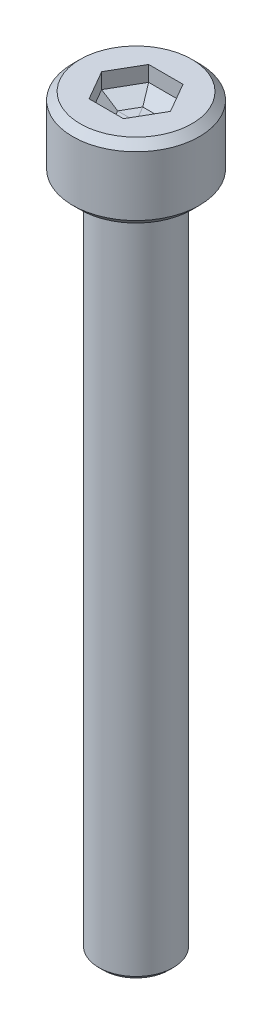
ISO-10303-21;
HEADER;
FILE_DESCRIPTION(('STEP AP214'),'2;1');
FILE_NAME('part.step','',(''),(''),'','','');
FILE_SCHEMA(('AUTOMOTIVE_DESIGN { 1 0 10303 214 1 1 1 1 }'));
ENDSEC;
DATA;
#1=APPLICATION_CONTEXT('core data for automotive mechanical design processes');
#2=APPLICATION_PROTOCOL_DEFINITION('international standard','automotive_design',2000,#1);
#3=PRODUCT_CONTEXT('',#1,'mechanical');
#4=PRODUCT('Part','Part','',(#3));
#5=PRODUCT_RELATED_PRODUCT_CATEGORY('part','',(#4));
#6=PRODUCT_DEFINITION_FORMATION('','',#4);
#7=PRODUCT_DEFINITION_CONTEXT('part definition',#1,'design');
#8=PRODUCT_DEFINITION('design','',#6,#7);
#9=PRODUCT_DEFINITION_SHAPE('','',#8);
#10=(LENGTH_UNIT() NAMED_UNIT(*) SI_UNIT(.MILLI.,.METRE.));
#11=(NAMED_UNIT(*) PLANE_ANGLE_UNIT() SI_UNIT($,.RADIAN.));
#12=(NAMED_UNIT(*) SI_UNIT($,.STERADIAN.) SOLID_ANGLE_UNIT());
#13=UNCERTAINTY_MEASURE_WITH_UNIT(LENGTH_MEASURE(1.E-05),#10,'distance_accuracy_value','');
#14=(GEOMETRIC_REPRESENTATION_CONTEXT(3) GLOBAL_UNCERTAINTY_ASSIGNED_CONTEXT((#13)) GLOBAL_UNIT_ASSIGNED_CONTEXT((#10,
#11,#12)) REPRESENTATION_CONTEXT('',''));
#15=CARTESIAN_POINT('',(0.,0.,0.));
#16=DIRECTION('',(0.,0.,1.));
#17=DIRECTION('',(1.,0.,0.));
#18=AXIS2_PLACEMENT_3D('',#15,#16,#17);
#19=CARTESIAN_POINT('',(4.25,5.00000000000001,0.));
#20=DIRECTION('',(0.,1.,0.));
#21=DIRECTION('',(-1.,0.,0.));
#22=AXIS2_PLACEMENT_3D('',#19,#20,#21);
#23=PLANE('',#22);
#24=DIRECTION('',(0.5,0.,-0.866025403784439));
#25=VECTOR('',#24,1.);
#26=CARTESIAN_POINT('',(-2.30940107675852,4.99999999999998,0.));
#27=LINE('',#26,#25);
#28=CARTESIAN_POINT('',(-2.30940107675852,4.99999999999998,0.));
#29=VERTEX_POINT('',#28);
#30=CARTESIAN_POINT('',(-1.15470053837928,4.99999999999999,-2.));
#31=VERTEX_POINT('',#30);
#32=EDGE_CURVE('E114',#29,#31,#27,.T.);
#33=ORIENTED_EDGE('',*,*,#32,.T.);
#34=DIRECTION('',(1.,0.,0.));
#35=VECTOR('',#34,1.);
#36=CARTESIAN_POINT('',(-1.15470053837929,4.99999999999998,-2.));
#37=LINE('',#36,#35);
#38=CARTESIAN_POINT('',(1.15470053837922,4.99999999999999,-2.00000000000001));
#39=VERTEX_POINT('',#38);
#40=EDGE_CURVE('E138',#31,#39,#37,.T.);
#41=ORIENTED_EDGE('',*,*,#40,.T.);
#42=DIRECTION('',(0.5,0.,0.866025403784439));
#43=VECTOR('',#42,1.);
#44=CARTESIAN_POINT('',(1.15470053837923,4.99999999999999,-2.00000000000001));
#45=LINE('',#44,#43);
#46=CARTESIAN_POINT('',(2.30940107675848,5.,0.));
#47=VERTEX_POINT('',#46);
#48=EDGE_CURVE('E463',#39,#47,#45,.T.);
#49=ORIENTED_EDGE('',*,*,#48,.T.);
#50=DIRECTION('',(-0.5,0.,0.866025403784439));
#51=VECTOR('',#50,1.);
#52=CARTESIAN_POINT('',(2.30940107675848,5.,0.));
#53=LINE('',#52,#51);
#54=CARTESIAN_POINT('',(1.15470053837923,5.,2.));
#55=VERTEX_POINT('',#54);
#56=EDGE_CURVE('E451',#47,#55,#53,.T.);
#57=ORIENTED_EDGE('',*,*,#56,.T.);
#58=DIRECTION('',(-1.,0.,0.));
#59=VECTOR('',#58,1.);
#60=CARTESIAN_POINT('',(1.15470053837923,5.,2.));
#61=LINE('',#60,#59);
#62=CARTESIAN_POINT('',(-1.15470053837927,4.99999999999999,2.));
#63=VERTEX_POINT('',#62);
#64=EDGE_CURVE('E48',#55,#63,#61,.T.);
#65=ORIENTED_EDGE('',*,*,#64,.T.);
#66=DIRECTION('',(-0.5,0.,-0.866025403784439));
#67=VECTOR('',#66,1.);
#68=CARTESIAN_POINT('',(-1.15470053837927,4.99999999999999,2.));
#69=LINE('',#68,#67);
#70=EDGE_CURVE('E107',#63,#29,#69,.T.);
#71=ORIENTED_EDGE('',*,*,#70,.T.);
#72=EDGE_LOOP('',(#33,#41,#49,#57,#65,#71));
#73=FACE_BOUND('',#72,.T.);
#74=CARTESIAN_POINT('',(0.,4.99999999999999,0.));
#75=DIRECTION('',(0.,1.,0.));
#76=DIRECTION('',(-1.,0.,0.));
#77=AXIS2_PLACEMENT_3D('',#74,#75,#76);
#78=CIRCLE('',#77,3.75000000000027);
#79=CARTESIAN_POINT('',(-3.75000000000029,4.99999999999998,0.));
#80=VERTEX_POINT('',#79);
#81=EDGE_CURVE('E11',#80,#80,#78,.T.);
#82=ORIENTED_EDGE('',*,*,#81,.T.);
#83=EDGE_LOOP('',(#82));
#84=FACE_BOUND('',#83,.T.);
#85=ADVANCED_FACE('F33',(#73,#84),#23,.T.);
#86=CARTESIAN_POINT('',(0.,-45.,0.));
#87=DIRECTION('',(0.,-1.,0.));
#88=DIRECTION('',(1.,0.,0.));
#89=AXIS2_PLACEMENT_3D('',#86,#87,#88);
#90=PLANE('',#89);
#91=CARTESIAN_POINT('',(1.52931237563455E-13,-45.,0.));
#92=DIRECTION('',(0.,-1.,0.));
#93=DIRECTION('',(1.,0.,0.));
#94=AXIS2_PLACEMENT_3D('',#91,#92,#93);
#95=CIRCLE('',#94,2.19999999999994);
#96=CARTESIAN_POINT('',(2.2000000000001,-45.,0.));
#97=VERTEX_POINT('',#96);
#98=EDGE_CURVE('E150',#97,#97,#95,.T.);
#99=ORIENTED_EDGE('',*,*,#98,.T.);
#100=EDGE_LOOP('',(#99));
#101=FACE_BOUND('',#100,.T.);
#102=ADVANCED_FACE('F187',(#101),#90,.T.);
#103=CARTESIAN_POINT('',(3.49148133884313E-12,-1001.19875270073,0.));
#104=DIRECTION('',(0.,-1.,0.));
#105=DIRECTION('',(1.,0.,0.));
#106=AXIS2_PLACEMENT_3D('',#103,#104,#105);
#107=CYLINDRICAL_SURFACE('',#106,2.49999999999993);
#108=CARTESIAN_POINT('',(1.51883793161802E-13,-44.7,0.));
#109=DIRECTION('',(0.,-1.,0.));
#110=DIRECTION('',(1.,0.,0.));
#111=AXIS2_PLACEMENT_3D('',#108,#109,#110);
#112=CIRCLE('',#111,2.49999999999993);
#113=CARTESIAN_POINT('',(2.50000000000008,-44.7,0.));
#114=VERTEX_POINT('',#113);
#115=EDGE_CURVE('E153',#114,#114,#112,.F.);
#116=ORIENTED_EDGE('',*,*,#115,.T.);
#117=EDGE_LOOP('',(#116));
#118=FACE_BOUND('',#117,.T.);
#119=CARTESIAN_POINT('',(0.,-0.199999999999978,0.));
#120=DIRECTION('',(0.,-1.,0.));
#121=DIRECTION('',(1.,0.,0.));
#122=AXIS2_PLACEMENT_3D('',#119,#120,#121);
#123=CIRCLE('',#122,2.49999999999993);
#124=CARTESIAN_POINT('',(2.49999999999992,-0.199999999999969,0.));
#125=VERTEX_POINT('',#124);
#126=EDGE_CURVE('E143',#125,#125,#123,.T.);
#127=ORIENTED_EDGE('',*,*,#126,.T.);
#128=EDGE_LOOP('',(#127));
#129=FACE_BOUND('',#128,.T.);
#130=ADVANCED_FACE('F176',(#118,#129),#107,.T.);
#131=CARTESIAN_POINT('',(2.5,0.,0.));
#132=DIRECTION('',(0.,-1.,0.));
#133=DIRECTION('',(1.,0.,0.));
#134=AXIS2_PLACEMENT_3D('',#131,#132,#133);
#135=PLANE('',#134);
#136=CARTESIAN_POINT('',(0.,0.,0.));
#137=DIRECTION('',(0.,-1.,0.));
#138=DIRECTION('',(1.,0.,0.));
#139=AXIS2_PLACEMENT_3D('',#136,#137,#138);
#140=CIRCLE('',#139,3.74999999999992);
#141=CARTESIAN_POINT('',(3.74999999999991,0.,0.));
#142=VERTEX_POINT('',#141);
#143=EDGE_CURVE('E156',#142,#142,#140,.T.);
#144=ORIENTED_EDGE('',*,*,#143,.T.);
#145=EDGE_LOOP('',(#144));
#146=FACE_BOUND('',#145,.T.);
#147=CARTESIAN_POINT('',(0.,0.,0.));
#148=DIRECTION('',(0.,-1.,0.));
#149=DIRECTION('',(1.,0.,0.));
#150=AXIS2_PLACEMENT_3D('',#147,#148,#149);
#151=CIRCLE('',#150,2.69999999999993);
#152=CARTESIAN_POINT('',(2.69999999999992,0.,0.));
#153=VERTEX_POINT('',#152);
#154=EDGE_CURVE('E146',#153,#153,#151,.F.);
#155=ORIENTED_EDGE('',*,*,#154,.T.);
#156=EDGE_LOOP('',(#155));
#157=FACE_BOUND('',#156,.T.);
#158=ADVANCED_FACE('F173',(#146,#157),#135,.T.);
#159=CARTESIAN_POINT('',(3.49148133884313E-12,-1001.19875270073,0.));
#160=DIRECTION('',(0.,-1.,0.));
#161=DIRECTION('',(1.,0.,0.));
#162=AXIS2_PLACEMENT_3D('',#159,#160,#161);
#163=CYLINDRICAL_SURFACE('',#162,4.25000000000001);
#164=CARTESIAN_POINT('',(0.,0.500000000000167,0.));
#165=DIRECTION('',(0.,-1.,0.));
#166=DIRECTION('',(1.,0.,0.));
#167=AXIS2_PLACEMENT_3D('',#164,#165,#166);
#168=CIRCLE('',#167,4.25000000000001);
#169=CARTESIAN_POINT('',(4.25000000000001,0.500000000000182,0.));
#170=VERTEX_POINT('',#169);
#171=EDGE_CURVE('E41',#170,#170,#168,.F.);
#172=ORIENTED_EDGE('',*,*,#171,.T.);
#173=EDGE_LOOP('',(#172));
#174=FACE_BOUND('',#173,.T.);
#175=CARTESIAN_POINT('',(0.,4.50000000000017,0.));
#176=DIRECTION('',(0.,1.,0.));
#177=DIRECTION('',(-1.,0.,0.));
#178=AXIS2_PLACEMENT_3D('',#175,#176,#177);
#179=CIRCLE('',#178,4.25000000000001);
#180=CARTESIAN_POINT('',(-4.25000000000003,4.50000000000016,0.));
#181=VERTEX_POINT('',#180);
#182=EDGE_CURVE('E159',#181,#181,#179,.F.);
#183=ORIENTED_EDGE('',*,*,#182,.T.);
#184=EDGE_LOOP('',(#183));
#185=FACE_BOUND('',#184,.T.);
#186=ADVANCED_FACE('F164',(#174,#185),#163,.T.);
#187=CARTESIAN_POINT('',(0.,-0.199999999999978,0.));
#188=DIRECTION('',(0.,-1.,0.));
#189=DIRECTION('',(1.,0.,0.));
#190=AXIS2_PLACEMENT_3D('',#187,#188,#189);
#191=TOROIDAL_SURFACE('',#190,2.69999999999993,0.2);
#192=ORIENTED_EDGE('',*,*,#154,.F.);
#193=EDGE_LOOP('',(#192));
#194=FACE_BOUND('',#193,.T.);
#195=ORIENTED_EDGE('',*,*,#126,.F.);
#196=EDGE_LOOP('',(#195));
#197=FACE_BOUND('',#196,.T.);
#198=ADVANCED_FACE('F180',(#194,#197),#191,.F.);
#199=CARTESIAN_POINT('',(1.52931237563455E-13,-45.,0.));
#200=DIRECTION('',(0.,1.,0.));
#201=DIRECTION('',(-1.,0.,0.));
#202=AXIS2_PLACEMENT_3D('',#199,#200,#201);
#203=CONICAL_SURFACE('',#202,2.19999999999991,0.785398163397345);
#204=ORIENTED_EDGE('',*,*,#115,.F.);
#205=EDGE_LOOP('',(#204));
#206=FACE_BOUND('',#205,.T.);
#207=ORIENTED_EDGE('',*,*,#98,.F.);
#208=EDGE_LOOP('',(#207));
#209=FACE_BOUND('',#208,.T.);
#210=ADVANCED_FACE('F170',(#206,#209),#203,.T.);
#211=CARTESIAN_POINT('',(0.,0.,0.));
#212=DIRECTION('',(0.,1.,0.));
#213=DIRECTION('',(-1.,0.,0.));
#214=AXIS2_PLACEMENT_3D('',#211,#212,#213);
#215=CONICAL_SURFACE('',#214,3.74999999999993,0.785398163397366);
#216=ORIENTED_EDGE('',*,*,#171,.F.);
#217=EDGE_LOOP('',(#216));
#218=FACE_BOUND('',#217,.T.);
#219=ORIENTED_EDGE('',*,*,#143,.F.);
#220=EDGE_LOOP('',(#219));
#221=FACE_BOUND('',#220,.T.);
#222=ADVANCED_FACE('F167',(#218,#221),#215,.T.);
#223=CARTESIAN_POINT('',(0.,4.50000000000017,0.));
#224=DIRECTION('',(0.,-1.,0.));
#225=DIRECTION('',(1.,0.,0.));
#226=AXIS2_PLACEMENT_3D('',#223,#224,#225);
#227=CONICAL_SURFACE('',#226,4.25000000000001,0.785398163397366);
#228=ORIENTED_EDGE('',*,*,#81,.F.);
#229=EDGE_LOOP('',(#228));
#230=FACE_BOUND('',#229,.T.);
#231=ORIENTED_EDGE('',*,*,#182,.F.);
#232=EDGE_LOOP('',(#231));
#233=FACE_BOUND('',#232,.T.);
#234=ADVANCED_FACE('F35',(#230,#233),#227,.T.);
#235=CARTESIAN_POINT('',(-2.30940107675852,4.99999999999998,0.));
#236=DIRECTION('',(-0.866025403784439,0.,-0.5));
#237=DIRECTION('',(-0.5,0.,0.866025403784439));
#238=AXIS2_PLACEMENT_3D('',#235,#236,#237);
#239=PLANE('',#238);
#240=ORIENTED_EDGE('',*,*,#32,.F.);
#241=DIRECTION('',(0.,1.,0.));
#242=VECTOR('',#241,1.);
#243=CARTESIAN_POINT('',(-2.30940107675852,4.99999999999998,0.));
#244=LINE('',#243,#242);
#245=CARTESIAN_POINT('',(-2.30940107675851,3.9563163170868,0.));
#246=VERTEX_POINT('',#245);
#247=EDGE_CURVE('E102',#246,#29,#244,.T.);
#248=ORIENTED_EDGE('',*,*,#247,.F.);
#249=DIRECTION('',(0.5,0.,-0.866025403784439));
#250=VECTOR('',#249,1.);
#251=CARTESIAN_POINT('',(-2.30940107675851,3.9563163170868,0.));
#252=LINE('',#251,#250);
#253=CARTESIAN_POINT('',(-1.15470053837927,3.9563163170868,-2.));
#254=VERTEX_POINT('',#253);
#255=EDGE_CURVE('E120',#246,#254,#252,.T.);
#256=ORIENTED_EDGE('',*,*,#255,.T.);
#257=DIRECTION('',(0.,1.,0.));
#258=VECTOR('',#257,1.);
#259=CARTESIAN_POINT('',(-1.15470053837929,4.99999999999998,-2.));
#260=LINE('',#259,#258);
#261=EDGE_CURVE('E116',#254,#31,#260,.T.);
#262=ORIENTED_EDGE('',*,*,#261,.T.);
#263=EDGE_LOOP('',(#240,#248,#256,#262));
#264=FACE_BOUND('',#263,.T.);
#265=ADVANCED_FACE('F115',(#264),#239,.F.);
#266=CARTESIAN_POINT('',(0.,3.25752210362396,0.));
#267=DIRECTION('',(0.,-1.,0.));
#268=DIRECTION('',(1.,0.,0.));
#269=AXIS2_PLACEMENT_3D('',#266,#267,#268);
#270=PLANE('',#269);
#271=DIRECTION('',(0.5,0.,-0.866025403784439));
#272=VECTOR('',#271,1.);
#273=CARTESIAN_POINT('',(-1.23537689685806,3.25752210362395,0.));
#274=LINE('',#273,#272);
#275=CARTESIAN_POINT('',(-1.23537689685807,3.25752210362395,0.));
#276=VERTEX_POINT('',#275);
#277=CARTESIAN_POINT('',(-0.617688448429044,3.25752210362395,-1.06986777592746));
#278=VERTEX_POINT('',#277);
#279=EDGE_CURVE('E135',#276,#278,#274,.T.);
#280=ORIENTED_EDGE('',*,*,#279,.F.);
#281=DIRECTION('',(1.,0.,0.));
#282=VECTOR('',#281,1.);
#283=CARTESIAN_POINT('',(0.,3.25752210362396,0.));
#284=LINE('',#283,#282);
#285=CARTESIAN_POINT('',(0.,3.25752210362396,0.));
#286=VERTEX_POINT('',#285);
#287=EDGE_CURVE('E124',#276,#286,#284,.T.);
#288=ORIENTED_EDGE('',*,*,#287,.T.);
#289=DIRECTION('',(-0.5,0.,-0.866025403784439));
#290=VECTOR('',#289,1.);
#291=CARTESIAN_POINT('',(0.,3.25752210362396,0.));
#292=LINE('',#291,#290);
#293=EDGE_CURVE('E57',#286,#278,#292,.T.);
#294=ORIENTED_EDGE('',*,*,#293,.T.);
#295=EDGE_LOOP('',(#280,#288,#294));
#296=FACE_BOUND('',#295,.T.);
#297=ADVANCED_FACE('F229',(#296),#270,.F.);
#298=CARTESIAN_POINT('',(-2.30940107675851,3.9563163170868,0.));
#299=DIRECTION('',(-0.520184407756901,-0.799506666160745,-0.300328607846694));
#300=DIRECTION('',(0.838201573918949,-0.545360542650269,0.));
#301=AXIS2_PLACEMENT_3D('',#298,#299,#300);
#302=PLANE('',#301);
#303=ORIENTED_EDGE('',*,*,#255,.F.);
#304=DIRECTION('',(0.838201573918949,-0.545360542650269,0.));
#305=VECTOR('',#304,1.);
#306=CARTESIAN_POINT('',(-1.49812940337573,3.42847722229215,0.));
#307=LINE('',#306,#305);
#308=EDGE_CURVE('E126',#246,#276,#307,.T.);
#309=ORIENTED_EDGE('',*,*,#308,.T.);
#310=ORIENTED_EDGE('',*,*,#279,.T.);
#311=DIRECTION('',(-0.419100786959478,0.545360542650269,-0.725903856505909));
#312=VECTOR('',#311,1.);
#313=CARTESIAN_POINT('',(-1.15470053837928,3.9563163170868,-2.));
#314=LINE('',#313,#312);
#315=EDGE_CURVE('E495',#278,#254,#314,.T.);
#316=ORIENTED_EDGE('',*,*,#315,.T.);
#317=EDGE_LOOP('',(#303,#309,#310,#316));
#318=FACE_BOUND('',#317,.T.);
#319=ADVANCED_FACE('F236',(#318),#302,.F.);
#320=CARTESIAN_POINT('',(-1.15470053837927,4.99999999999999,2.));
#321=DIRECTION('',(-0.866025403784439,0.,0.5));
#322=DIRECTION('',(0.5,0.,0.866025403784439));
#323=AXIS2_PLACEMENT_3D('',#320,#321,#322);
#324=PLANE('',#323);
#325=ORIENTED_EDGE('',*,*,#70,.F.);
#326=DIRECTION('',(0.,1.,0.));
#327=VECTOR('',#326,1.);
#328=CARTESIAN_POINT('',(-1.15470053837927,4.99999999999999,2.));
#329=LINE('',#328,#327);
#330=CARTESIAN_POINT('',(-1.15470053837927,3.9563163170868,2.));
#331=VERTEX_POINT('',#330);
#332=EDGE_CURVE('E479',#331,#63,#329,.T.);
#333=ORIENTED_EDGE('',*,*,#332,.F.);
#334=DIRECTION('',(-0.5,0.,-0.866025403784439));
#335=VECTOR('',#334,1.);
#336=CARTESIAN_POINT('',(-1.15470053837926,3.9563163170868,2.));
#337=LINE('',#336,#335);
#338=EDGE_CURVE('E109',#331,#246,#337,.T.);
#339=ORIENTED_EDGE('',*,*,#338,.T.);
#340=ORIENTED_EDGE('',*,*,#247,.T.);
#341=EDGE_LOOP('',(#325,#333,#339,#340));
#342=FACE_BOUND('',#341,.T.);
#343=ADVANCED_FACE('F104',(#342),#324,.F.);
#344=CARTESIAN_POINT('',(0.,3.25752210362396,0.));
#345=DIRECTION('',(0.,-1.,0.));
#346=DIRECTION('',(1.,0.,0.));
#347=AXIS2_PLACEMENT_3D('',#344,#345,#346);
#348=PLANE('',#347);
#349=DIRECTION('',(-0.5,0.,-0.866025403784439));
#350=VECTOR('',#349,1.);
#351=CARTESIAN_POINT('',(-0.617688448429039,3.25752210362395,1.06986777592746));
#352=LINE('',#351,#350);
#353=CARTESIAN_POINT('',(-0.617688448429039,3.25752210362395,1.06986777592746));
#354=VERTEX_POINT('',#353);
#355=EDGE_CURVE('E133',#354,#276,#352,.T.);
#356=ORIENTED_EDGE('',*,*,#355,.F.);
#357=DIRECTION('',(0.5,0.,-0.866025403784439));
#358=VECTOR('',#357,1.);
#359=CARTESIAN_POINT('',(0.,3.25752210362396,0.));
#360=LINE('',#359,#358);
#361=EDGE_CURVE('E480',#354,#286,#360,.T.);
#362=ORIENTED_EDGE('',*,*,#361,.T.);
#363=ORIENTED_EDGE('',*,*,#287,.F.);
#364=EDGE_LOOP('',(#356,#362,#363));
#365=FACE_BOUND('',#364,.T.);
#366=ADVANCED_FACE('F251',(#365),#348,.F.);
#367=CARTESIAN_POINT('',(-1.15470053837926,3.9563163170868,2.));
#368=DIRECTION('',(-0.520184407756901,-0.799506666160745,0.300328607846694));
#369=DIRECTION('',(0.838201573918949,-0.545360542650269,0.));
#370=AXIS2_PLACEMENT_3D('',#367,#368,#369);
#371=PLANE('',#370);
#372=ORIENTED_EDGE('',*,*,#338,.F.);
#373=DIRECTION('',(0.419100786959476,-0.545360542650271,-0.725903856505908));
#374=VECTOR('',#373,1.);
#375=CARTESIAN_POINT('',(-0.749064701687873,3.42847722229216,1.2974181214798));
#376=LINE('',#375,#374);
#377=EDGE_CURVE('E485',#331,#354,#376,.T.);
#378=ORIENTED_EDGE('',*,*,#377,.T.);
#379=ORIENTED_EDGE('',*,*,#355,.T.);
#380=ORIENTED_EDGE('',*,*,#308,.F.);
#381=EDGE_LOOP('',(#372,#378,#379,#380));
#382=FACE_BOUND('',#381,.T.);
#383=ADVANCED_FACE('F258',(#382),#371,.F.);
#384=CARTESIAN_POINT('',(-1.15470053837929,4.99999999999998,-2.));
#385=DIRECTION('',(0.,0.,-1.));
#386=DIRECTION('',(0.,1.,0.));
#387=AXIS2_PLACEMENT_3D('',#384,#385,#386);
#388=PLANE('',#387);
#389=ORIENTED_EDGE('',*,*,#40,.F.);
#390=ORIENTED_EDGE('',*,*,#261,.F.);
#391=DIRECTION('',(1.,0.,0.));
#392=VECTOR('',#391,1.);
#393=CARTESIAN_POINT('',(-1.15470053837928,3.9563163170868,-2.));
#394=LINE('',#393,#392);
#395=CARTESIAN_POINT('',(1.15470053837923,3.95631631708681,-2.));
#396=VERTEX_POINT('',#395);
#397=EDGE_CURVE('E493',#254,#396,#394,.T.);
#398=ORIENTED_EDGE('',*,*,#397,.T.);
#399=DIRECTION('',(0.,1.,0.));
#400=VECTOR('',#399,1.);
#401=CARTESIAN_POINT('',(1.15470053837923,4.99999999999999,-2.00000000000001));
#402=LINE('',#401,#400);
#403=EDGE_CURVE('E468',#396,#39,#402,.T.);
#404=ORIENTED_EDGE('',*,*,#403,.T.);
#405=EDGE_LOOP('',(#389,#390,#398,#404));
#406=FACE_BOUND('',#405,.T.);
#407=ADVANCED_FACE('F266',(#406),#388,.F.);
#408=CARTESIAN_POINT('',(0.,3.25752210362396,0.));
#409=DIRECTION('',(0.,-1.,0.));
#410=DIRECTION('',(0.,0.,-1.));
#411=AXIS2_PLACEMENT_3D('',#408,#409,#410);
#412=PLANE('',#411);
#413=DIRECTION('',(1.,0.,0.));
#414=VECTOR('',#413,1.);
#415=CARTESIAN_POINT('',(-0.617688448429051,3.25752210362395,-1.06986777592746));
#416=LINE('',#415,#414);
#417=CARTESIAN_POINT('',(0.617688448429012,3.25752210362395,-1.06986777592747));
#418=VERTEX_POINT('',#417);
#419=EDGE_CURVE('E129',#278,#418,#416,.T.);
#420=ORIENTED_EDGE('',*,*,#419,.F.);
#421=ORIENTED_EDGE('',*,*,#293,.F.);
#422=DIRECTION('',(0.5,0.,-0.866025403784439));
#423=VECTOR('',#422,1.);
#424=CARTESIAN_POINT('',(0.,3.25752210362396,0.));
#425=LINE('',#424,#423);
#426=EDGE_CURVE('E460',#286,#418,#425,.T.);
#427=ORIENTED_EDGE('',*,*,#426,.T.);
#428=EDGE_LOOP('',(#420,#421,#427));
#429=FACE_BOUND('',#428,.T.);
#430=ADVANCED_FACE('F274',(#429),#412,.F.);
#431=CARTESIAN_POINT('',(-1.15470053837928,3.9563163170868,-2.));
#432=DIRECTION('',(0.,-0.799506666160744,-0.600657215693388));
#433=DIRECTION('',(0.,0.600657215693388,-0.799506666160744));
#434=AXIS2_PLACEMENT_3D('',#431,#432,#433);
#435=PLANE('',#434);
#436=ORIENTED_EDGE('',*,*,#397,.F.);
#437=ORIENTED_EDGE('',*,*,#315,.F.);
#438=ORIENTED_EDGE('',*,*,#419,.T.);
#439=DIRECTION('',(0.419100786959471,0.545360542650272,-0.72590385650591));
#440=VECTOR('',#439,1.);
#441=CARTESIAN_POINT('',(1.15470053837923,3.95631631708681,-2.00000000000001));
#442=LINE('',#441,#440);
#443=EDGE_CURVE('E470',#418,#396,#442,.T.);
#444=ORIENTED_EDGE('',*,*,#443,.T.);
#445=EDGE_LOOP('',(#436,#437,#438,#444));
#446=FACE_BOUND('',#445,.T.);
#447=ADVANCED_FACE('F282',(#446),#435,.F.);
#448=CARTESIAN_POINT('',(1.15470053837923,5.,2.));
#449=DIRECTION('',(0.,0.,1.));
#450=DIRECTION('',(0.,-1.,0.));
#451=AXIS2_PLACEMENT_3D('',#448,#449,#450);
#452=PLANE('',#451);
#453=ORIENTED_EDGE('',*,*,#64,.F.);
#454=DIRECTION('',(0.,1.,0.));
#455=VECTOR('',#454,1.);
#456=CARTESIAN_POINT('',(1.15470053837923,5.,2.));
#457=LINE('',#456,#455);
#458=CARTESIAN_POINT('',(1.15470053837923,3.95631631708681,2.));
#459=VERTEX_POINT('',#458);
#460=EDGE_CURVE('E447',#459,#55,#457,.T.);
#461=ORIENTED_EDGE('',*,*,#460,.F.);
#462=DIRECTION('',(-1.,0.,0.));
#463=VECTOR('',#462,1.);
#464=CARTESIAN_POINT('',(1.15470053837923,3.95631631708681,2.));
#465=LINE('',#464,#463);
#466=EDGE_CURVE('E482',#459,#331,#465,.T.);
#467=ORIENTED_EDGE('',*,*,#466,.T.);
#468=ORIENTED_EDGE('',*,*,#332,.T.);
#469=EDGE_LOOP('',(#453,#461,#467,#468));
#470=FACE_BOUND('',#469,.T.);
#471=ADVANCED_FACE('F289',(#470),#452,.F.);
#472=CARTESIAN_POINT('',(0.,3.25752210362396,0.));
#473=DIRECTION('',(0.,-1.,0.));
#474=DIRECTION('',(0.,0.,-1.));
#475=AXIS2_PLACEMENT_3D('',#472,#473,#474);
#476=PLANE('',#475);
#477=DIRECTION('',(-1.,0.,0.));
#478=VECTOR('',#477,1.);
#479=CARTESIAN_POINT('',(0.617688448429013,3.25752210362395,1.06986777592746));
#480=LINE('',#479,#478);
#481=CARTESIAN_POINT('',(0.617688448429014,3.25752210362395,1.06986777592746));
#482=VERTEX_POINT('',#481);
#483=EDGE_CURVE('E467',#482,#354,#480,.T.);
#484=ORIENTED_EDGE('',*,*,#483,.F.);
#485=DIRECTION('',(-0.5,0.,-0.866025403784439));
#486=VECTOR('',#485,1.);
#487=CARTESIAN_POINT('',(0.,3.25752210362396,0.));
#488=LINE('',#487,#486);
#489=EDGE_CURVE('E459',#482,#286,#488,.T.);
#490=ORIENTED_EDGE('',*,*,#489,.T.);
#491=ORIENTED_EDGE('',*,*,#361,.F.);
#492=EDGE_LOOP('',(#484,#490,#491));
#493=FACE_BOUND('',#492,.T.);
#494=ADVANCED_FACE('F297',(#493),#476,.F.);
#495=CARTESIAN_POINT('',(1.15470053837923,3.95631631708681,2.));
#496=DIRECTION('',(0.,-0.799506666160743,0.600657215693389));
#497=DIRECTION('',(0.,-0.600657215693389,-0.799506666160743));
#498=AXIS2_PLACEMENT_3D('',#495,#496,#497);
#499=PLANE('',#498);
#500=ORIENTED_EDGE('',*,*,#466,.F.);
#501=DIRECTION('',(-0.419100786959472,-0.545360542650274,-0.725903856505908));
#502=VECTOR('',#501,1.);
#503=CARTESIAN_POINT('',(0.749064701687847,3.42847722229216,1.2974181214798));
#504=LINE('',#503,#502);
#505=EDGE_CURVE('E442',#459,#482,#504,.T.);
#506=ORIENTED_EDGE('',*,*,#505,.T.);
#507=ORIENTED_EDGE('',*,*,#483,.T.);
#508=ORIENTED_EDGE('',*,*,#377,.F.);
#509=EDGE_LOOP('',(#500,#506,#507,#508));
#510=FACE_BOUND('',#509,.T.);
#511=ADVANCED_FACE('F304',(#510),#499,.F.);
#512=CARTESIAN_POINT('',(1.15470053837923,4.99999999999999,-2.00000000000001));
#513=DIRECTION('',(0.866025403784439,0.,-0.5));
#514=DIRECTION('',(-0.5,0.,-0.866025403784438));
#515=AXIS2_PLACEMENT_3D('',#512,#513,#514);
#516=PLANE('',#515);
#517=ORIENTED_EDGE('',*,*,#48,.F.);
#518=ORIENTED_EDGE('',*,*,#403,.F.);
#519=DIRECTION('',(0.5,0.,0.866025403784439));
#520=VECTOR('',#519,1.);
#521=CARTESIAN_POINT('',(1.15470053837923,3.95631631708681,-2.00000000000001));
#522=LINE('',#521,#520);
#523=CARTESIAN_POINT('',(2.30940107675848,3.95631631708681,0.));
#524=VERTEX_POINT('',#523);
#525=EDGE_CURVE('E466',#396,#524,#522,.T.);
#526=ORIENTED_EDGE('',*,*,#525,.T.);
#527=DIRECTION('',(0.,1.,0.));
#528=VECTOR('',#527,1.);
#529=CARTESIAN_POINT('',(2.30940107675848,5.,0.));
#530=LINE('',#529,#528);
#531=EDGE_CURVE('E449',#524,#47,#530,.T.);
#532=ORIENTED_EDGE('',*,*,#531,.T.);
#533=EDGE_LOOP('',(#517,#518,#526,#532));
#534=FACE_BOUND('',#533,.T.);
#535=ADVANCED_FACE('F312',(#534),#516,.F.);
#536=CARTESIAN_POINT('',(0.,3.25752210362396,0.));
#537=DIRECTION('',(0.,-1.,0.));
#538=DIRECTION('',(0.,0.,-1.));
#539=AXIS2_PLACEMENT_3D('',#536,#537,#538);
#540=PLANE('',#539);
#541=DIRECTION('',(0.5,0.,0.866025403784439));
#542=VECTOR('',#541,1.);
#543=CARTESIAN_POINT('',(0.617688448429011,3.25752210362395,-1.06986777592747));
#544=LINE('',#543,#542);
#545=CARTESIAN_POINT('',(1.23537689685804,3.25752210362395,0.));
#546=VERTEX_POINT('',#545);
#547=EDGE_CURVE('E471',#418,#546,#544,.T.);
#548=ORIENTED_EDGE('',*,*,#547,.F.);
#549=ORIENTED_EDGE('',*,*,#426,.F.);
#550=DIRECTION('',(1.,0.,0.));
#551=VECTOR('',#550,1.);
#552=CARTESIAN_POINT('',(0.,3.25752210362396,0.));
#553=LINE('',#552,#551);
#554=EDGE_CURVE('E147',#286,#546,#553,.T.);
#555=ORIENTED_EDGE('',*,*,#554,.T.);
#556=EDGE_LOOP('',(#548,#549,#555));
#557=FACE_BOUND('',#556,.T.);
#558=ADVANCED_FACE('F320',(#557),#540,.F.);
#559=CARTESIAN_POINT('',(1.15470053837923,3.95631631708681,-2.00000000000001));
#560=DIRECTION('',(0.520184407756906,-0.799506666160742,-0.300328607846694));
#561=DIRECTION('',(0.838201573918946,0.545360542650274,0.));
#562=AXIS2_PLACEMENT_3D('',#559,#560,#561);
#563=PLANE('',#562);
#564=ORIENTED_EDGE('',*,*,#525,.F.);
#565=ORIENTED_EDGE('',*,*,#443,.F.);
#566=ORIENTED_EDGE('',*,*,#547,.T.);
#567=DIRECTION('',(0.838201573918946,0.545360542650275,0.));
#568=VECTOR('',#567,1.);
#569=CARTESIAN_POINT('',(2.30940107675848,3.95631631708682,0.));
#570=LINE('',#569,#568);
#571=EDGE_CURVE('E439',#546,#524,#570,.T.);
#572=ORIENTED_EDGE('',*,*,#571,.T.);
#573=EDGE_LOOP('',(#564,#565,#566,#572));
#574=FACE_BOUND('',#573,.T.);
#575=ADVANCED_FACE('F328',(#574),#563,.F.);
#576=CARTESIAN_POINT('',(2.30940107675848,5.,0.));
#577=DIRECTION('',(0.866025403784439,0.,0.5));
#578=DIRECTION('',(0.5,0.,-0.866025403784439));
#579=AXIS2_PLACEMENT_3D('',#576,#577,#578);
#580=PLANE('',#579);
#581=ORIENTED_EDGE('',*,*,#56,.F.);
#582=ORIENTED_EDGE('',*,*,#531,.F.);
#583=DIRECTION('',(-0.5,0.,0.866025403784439));
#584=VECTOR('',#583,1.);
#585=CARTESIAN_POINT('',(2.30940107675848,3.95631631708682,0.));
#586=LINE('',#585,#584);
#587=EDGE_CURVE('E436',#524,#459,#586,.T.);
#588=ORIENTED_EDGE('',*,*,#587,.T.);
#589=ORIENTED_EDGE('',*,*,#460,.T.);
#590=EDGE_LOOP('',(#581,#582,#588,#589));
#591=FACE_BOUND('',#590,.T.);
#592=ADVANCED_FACE('F336',(#591),#580,.F.);
#593=CARTESIAN_POINT('',(0.,3.25752210362396,0.));
#594=DIRECTION('',(0.,-1.,0.));
#595=DIRECTION('',(0.,0.,-1.));
#596=AXIS2_PLACEMENT_3D('',#593,#594,#595);
#597=PLANE('',#596);
#598=DIRECTION('',(-0.5,0.,0.866025403784439));
#599=VECTOR('',#598,1.);
#600=CARTESIAN_POINT('',(1.23537689685804,3.25752210362396,0.));
#601=LINE('',#600,#599);
#602=EDGE_CURVE('E446',#546,#482,#601,.T.);
#603=ORIENTED_EDGE('',*,*,#602,.F.);
#604=ORIENTED_EDGE('',*,*,#554,.F.);
#605=ORIENTED_EDGE('',*,*,#489,.F.);
#606=EDGE_LOOP('',(#603,#604,#605));
#607=FACE_BOUND('',#606,.T.);
#608=ADVANCED_FACE('F344',(#607),#597,.F.);
#609=CARTESIAN_POINT('',(2.30940107675848,3.95631631708682,0.));
#610=DIRECTION('',(0.520184407756907,-0.799506666160741,0.300328607846695));
#611=DIRECTION('',(0.838201573918946,0.545360542650275,0.));
#612=AXIS2_PLACEMENT_3D('',#609,#610,#611);
#613=PLANE('',#612);
#614=ORIENTED_EDGE('',*,*,#587,.F.);
#615=ORIENTED_EDGE('',*,*,#571,.F.);
#616=ORIENTED_EDGE('',*,*,#602,.T.);
#617=ORIENTED_EDGE('',*,*,#505,.F.);
#618=EDGE_LOOP('',(#614,#615,#616,#617));
#619=FACE_BOUND('',#618,.T.);
#620=ADVANCED_FACE('F223',(#619),#613,.F.);
#621=CLOSED_SHELL('',(#85,#102,#130,#158,#186,#198,#210,#222,#234,#265,#297,#319,#343,#366,#383,
#407,#430,#447,#471,#494,#511,#535,#558,#575,#592,#608,#620));
#622=MANIFOLD_SOLID_BREP('B2',#621);
#623=ADVANCED_BREP_SHAPE_REPRESENTATION('',(#18,#622),#14);
#624=SHAPE_DEFINITION_REPRESENTATION(#9,#623);
ENDSEC;
END-ISO-10303-21;
